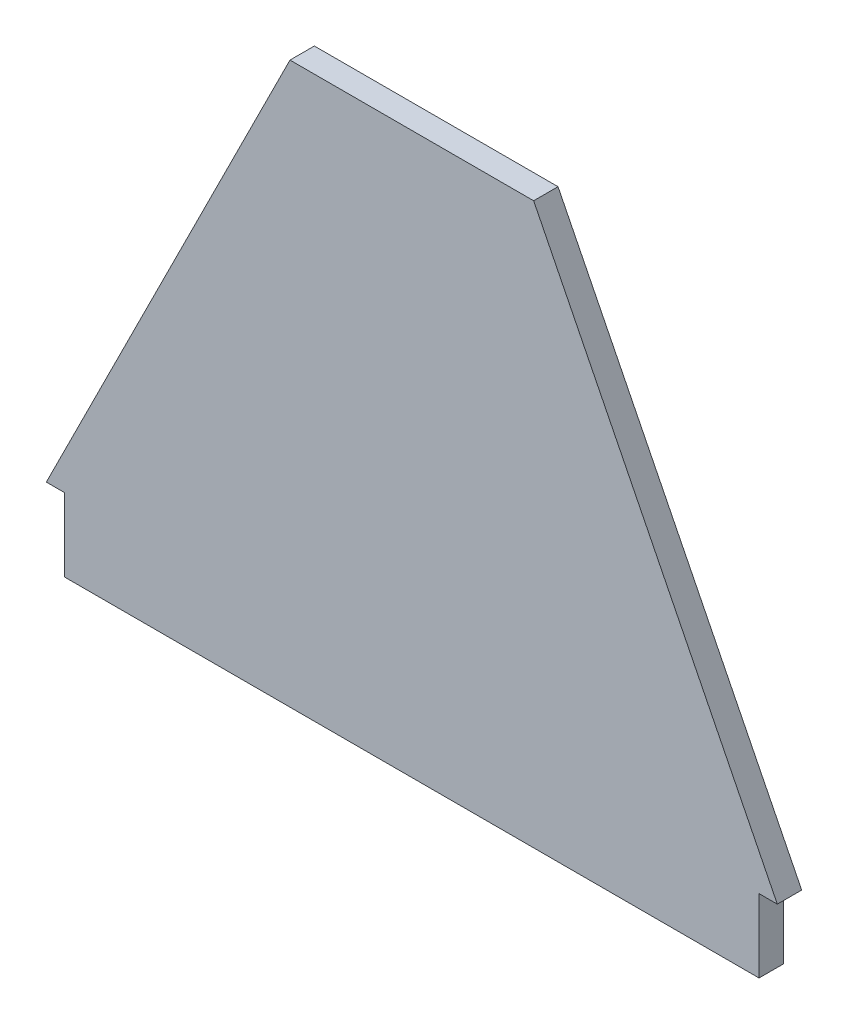
ISO-10303-21;
HEADER;
FILE_DESCRIPTION(('STEP AP214'),'2;1');
FILE_NAME('part.step','',(''),(''),'','','');
FILE_SCHEMA(('AUTOMOTIVE_DESIGN { 1 0 10303 214 1 1 1 1 }'));
ENDSEC;
DATA;
#1=APPLICATION_CONTEXT('core data for automotive mechanical design processes');
#2=APPLICATION_PROTOCOL_DEFINITION('international standard','automotive_design',2000,#1);
#3=PRODUCT_CONTEXT('',#1,'mechanical');
#4=PRODUCT('Part','Part','',(#3));
#5=PRODUCT_RELATED_PRODUCT_CATEGORY('part','',(#4));
#6=PRODUCT_DEFINITION_FORMATION('','',#4);
#7=PRODUCT_DEFINITION_CONTEXT('part definition',#1,'design');
#8=PRODUCT_DEFINITION('design','',#6,#7);
#9=PRODUCT_DEFINITION_SHAPE('','',#8);
#10=(LENGTH_UNIT() NAMED_UNIT(*) SI_UNIT(.MILLI.,.METRE.));
#11=(NAMED_UNIT(*) PLANE_ANGLE_UNIT() SI_UNIT($,.RADIAN.));
#12=(NAMED_UNIT(*) SI_UNIT($,.STERADIAN.) SOLID_ANGLE_UNIT());
#13=UNCERTAINTY_MEASURE_WITH_UNIT(LENGTH_MEASURE(1.E-05),#10,'distance_accuracy_value','');
#14=(GEOMETRIC_REPRESENTATION_CONTEXT(3) GLOBAL_UNCERTAINTY_ASSIGNED_CONTEXT((#13)) GLOBAL_UNIT_ASSIGNED_CONTEXT((#10,
#11,#12)) REPRESENTATION_CONTEXT('',''));
#15=CARTESIAN_POINT('',(0.,0.,0.));
#16=DIRECTION('',(0.,0.,1.));
#17=DIRECTION('',(1.,0.,0.));
#18=AXIS2_PLACEMENT_3D('',#15,#16,#17);
#19=CARTESIAN_POINT('',(-71.25,11.7259138972511,5.));
#20=DIRECTION('',(0.,1.,0.));
#21=DIRECTION('',(0.,0.,1.));
#22=AXIS2_PLACEMENT_3D('',#19,#20,#21);
#23=PLANE('',#22);
#24=DIRECTION('',(1.,0.,0.));
#25=VECTOR('',#24,1.);
#26=CARTESIAN_POINT('',(-71.25,11.7259138972511,0.));
#27=LINE('',#26,#25);
#28=CARTESIAN_POINT('',(-75.,11.7259138972511,0.));
#29=VERTEX_POINT('',#28);
#30=CARTESIAN_POINT('',(-71.25,11.7259138972511,0.));
#31=VERTEX_POINT('',#30);
#32=EDGE_CURVE('E135',#29,#31,#27,.T.);
#33=ORIENTED_EDGE('',*,*,#32,.T.);
#34=DIRECTION('',(0.,0.,-1.));
#35=VECTOR('',#34,1.);
#36=CARTESIAN_POINT('',(-71.25,11.7259138972511,5.));
#37=LINE('',#36,#35);
#38=CARTESIAN_POINT('',(-71.25,11.7259138972511,5.));
#39=VERTEX_POINT('',#38);
#40=EDGE_CURVE('E11',#39,#31,#37,.T.);
#41=ORIENTED_EDGE('',*,*,#40,.F.);
#42=DIRECTION('',(1.,0.,0.));
#43=VECTOR('',#42,1.);
#44=CARTESIAN_POINT('',(-71.25,11.7259138972511,5.));
#45=LINE('',#44,#43);
#46=CARTESIAN_POINT('',(-75.,11.7259138972511,5.));
#47=VERTEX_POINT('',#46);
#48=EDGE_CURVE('E149',#47,#39,#45,.T.);
#49=ORIENTED_EDGE('',*,*,#48,.F.);
#50=DIRECTION('',(0.,0.,-1.));
#51=VECTOR('',#50,1.);
#52=CARTESIAN_POINT('',(-75.,11.7259138972511,5.));
#53=LINE('',#52,#51);
#54=EDGE_CURVE('E131',#47,#29,#53,.T.);
#55=ORIENTED_EDGE('',*,*,#54,.T.);
#56=EDGE_LOOP('',(#33,#41,#49,#55));
#57=FACE_BOUND('',#56,.T.);
#58=ADVANCED_FACE('F39',(#57),#23,.F.);
#59=CARTESIAN_POINT('',(-71.25,-3.27408610274891,5.));
#60=DIRECTION('',(1.,0.,0.));
#61=DIRECTION('',(0.,0.,-1.));
#62=AXIS2_PLACEMENT_3D('',#59,#60,#61);
#63=PLANE('',#62);
#64=DIRECTION('',(0.,-1.,0.));
#65=VECTOR('',#64,1.);
#66=CARTESIAN_POINT('',(-71.25,-3.27408610274891,0.));
#67=LINE('',#66,#65);
#68=CARTESIAN_POINT('',(-71.25,-3.27408610274891,0.));
#69=VERTEX_POINT('',#68);
#70=EDGE_CURVE('E138',#31,#69,#67,.T.);
#71=ORIENTED_EDGE('',*,*,#70,.T.);
#72=DIRECTION('',(0.,0.,-1.));
#73=VECTOR('',#72,1.);
#74=CARTESIAN_POINT('',(-71.25,-3.27408610274891,5.));
#75=LINE('',#74,#73);
#76=CARTESIAN_POINT('',(-71.25,-3.27408610274891,5.));
#77=VERTEX_POINT('',#76);
#78=EDGE_CURVE('E47',#77,#69,#75,.T.);
#79=ORIENTED_EDGE('',*,*,#78,.F.);
#80=DIRECTION('',(0.,-1.,0.));
#81=VECTOR('',#80,1.);
#82=CARTESIAN_POINT('',(-71.25,-3.27408610274891,5.));
#83=LINE('',#82,#81);
#84=EDGE_CURVE('E98',#39,#77,#83,.T.);
#85=ORIENTED_EDGE('',*,*,#84,.F.);
#86=ORIENTED_EDGE('',*,*,#40,.T.);
#87=EDGE_LOOP('',(#71,#79,#85,#86));
#88=FACE_BOUND('',#87,.T.);
#89=ADVANCED_FACE('F184',(#88),#63,.F.);
#90=CARTESIAN_POINT('',(71.25,-3.27408610274891,5.));
#91=DIRECTION('',(0.,1.,0.));
#92=DIRECTION('',(0.,0.,1.));
#93=AXIS2_PLACEMENT_3D('',#90,#91,#92);
#94=PLANE('',#93);
#95=DIRECTION('',(1.,0.,0.));
#96=VECTOR('',#95,1.);
#97=CARTESIAN_POINT('',(71.25,-3.27408610274891,0.));
#98=LINE('',#97,#96);
#99=CARTESIAN_POINT('',(71.25,-3.27408610274891,0.));
#100=VERTEX_POINT('',#99);
#101=EDGE_CURVE('E140',#69,#100,#98,.T.);
#102=ORIENTED_EDGE('',*,*,#101,.T.);
#103=DIRECTION('',(0.,0.,-1.));
#104=VECTOR('',#103,1.);
#105=CARTESIAN_POINT('',(71.25,-3.27408610274891,5.));
#106=LINE('',#105,#104);
#107=CARTESIAN_POINT('',(71.25,-3.27408610274891,5.));
#108=VERTEX_POINT('',#107);
#109=EDGE_CURVE('E156',#108,#100,#106,.T.);
#110=ORIENTED_EDGE('',*,*,#109,.F.);
#111=DIRECTION('',(1.,0.,0.));
#112=VECTOR('',#111,1.);
#113=CARTESIAN_POINT('',(71.25,-3.27408610274891,5.));
#114=LINE('',#113,#112);
#115=EDGE_CURVE('E164',#77,#108,#114,.T.);
#116=ORIENTED_EDGE('',*,*,#115,.F.);
#117=ORIENTED_EDGE('',*,*,#78,.T.);
#118=EDGE_LOOP('',(#102,#110,#116,#117));
#119=FACE_BOUND('',#118,.T.);
#120=ADVANCED_FACE('F162',(#119),#94,.F.);
#121=CARTESIAN_POINT('',(71.25,11.7259138972511,5.));
#122=DIRECTION('',(-1.,0.,0.));
#123=DIRECTION('',(0.,0.,1.));
#124=AXIS2_PLACEMENT_3D('',#121,#122,#123);
#125=PLANE('',#124);
#126=DIRECTION('',(0.,1.,0.));
#127=VECTOR('',#126,1.);
#128=CARTESIAN_POINT('',(71.25,11.7259138972511,0.));
#129=LINE('',#128,#127);
#130=CARTESIAN_POINT('',(71.25,11.7259138972511,0.));
#131=VERTEX_POINT('',#130);
#132=EDGE_CURVE('E142',#100,#131,#129,.T.);
#133=ORIENTED_EDGE('',*,*,#132,.T.);
#134=DIRECTION('',(0.,0.,-1.));
#135=VECTOR('',#134,1.);
#136=CARTESIAN_POINT('',(71.25,11.7259138972511,5.));
#137=LINE('',#136,#135);
#138=CARTESIAN_POINT('',(71.25,11.7259138972511,5.));
#139=VERTEX_POINT('',#138);
#140=EDGE_CURVE('E153',#139,#131,#137,.T.);
#141=ORIENTED_EDGE('',*,*,#140,.F.);
#142=DIRECTION('',(0.,1.,0.));
#143=VECTOR('',#142,1.);
#144=CARTESIAN_POINT('',(71.25,11.7259138972511,5.));
#145=LINE('',#144,#143);
#146=EDGE_CURVE('E176',#108,#139,#145,.T.);
#147=ORIENTED_EDGE('',*,*,#146,.F.);
#148=ORIENTED_EDGE('',*,*,#109,.T.);
#149=EDGE_LOOP('',(#133,#141,#147,#148));
#150=FACE_BOUND('',#149,.T.);
#151=ADVANCED_FACE('F172',(#150),#125,.F.);
#152=CARTESIAN_POINT('',(75.,11.7259138972511,5.));
#153=DIRECTION('',(0.,1.,0.));
#154=DIRECTION('',(-1.,0.,0.));
#155=AXIS2_PLACEMENT_3D('',#152,#153,#154);
#156=PLANE('',#155);
#157=DIRECTION('',(1.,0.,0.));
#158=VECTOR('',#157,1.);
#159=CARTESIAN_POINT('',(75.,11.7259138972511,0.));
#160=LINE('',#159,#158);
#161=CARTESIAN_POINT('',(75.,11.7259138972511,0.));
#162=VERTEX_POINT('',#161);
#163=EDGE_CURVE('E144',#131,#162,#160,.T.);
#164=ORIENTED_EDGE('',*,*,#163,.T.);
#165=DIRECTION('',(0.,0.,-1.));
#166=VECTOR('',#165,1.);
#167=CARTESIAN_POINT('',(75.,11.7259138972511,5.));
#168=LINE('',#167,#166);
#169=CARTESIAN_POINT('',(75.,11.7259138972511,5.));
#170=VERTEX_POINT('',#169);
#171=EDGE_CURVE('E126',#170,#162,#168,.T.);
#172=ORIENTED_EDGE('',*,*,#171,.F.);
#173=DIRECTION('',(1.,0.,0.));
#174=VECTOR('',#173,1.);
#175=CARTESIAN_POINT('',(75.,11.7259138972511,5.));
#176=LINE('',#175,#174);
#177=EDGE_CURVE('E117',#139,#170,#176,.T.);
#178=ORIENTED_EDGE('',*,*,#177,.F.);
#179=ORIENTED_EDGE('',*,*,#140,.T.);
#180=EDGE_LOOP('',(#164,#172,#178,#179));
#181=FACE_BOUND('',#180,.T.);
#182=ADVANCED_FACE('F175',(#181),#156,.F.);
#183=CARTESIAN_POINT('',(75.,11.7259138972511,5.));
#184=DIRECTION('',(-0.894427190999916,-0.447213595499958,0.));
#185=DIRECTION('',(0.447213595499958,-0.894427190999916,0.));
#186=AXIS2_PLACEMENT_3D('',#183,#184,#185);
#187=PLANE('',#186);
#188=DIRECTION('',(-0.447213595499958,0.894427190999916,0.));
#189=VECTOR('',#188,1.);
#190=CARTESIAN_POINT('',(75.,11.7259138972511,0.));
#191=LINE('',#190,#189);
#192=CARTESIAN_POINT('',(25.,111.725913897251,0.));
#193=VERTEX_POINT('',#192);
#194=EDGE_CURVE('E125',#162,#193,#191,.T.);
#195=ORIENTED_EDGE('',*,*,#194,.T.);
#196=DIRECTION('',(0.,0.,-1.));
#197=VECTOR('',#196,1.);
#198=CARTESIAN_POINT('',(25.,111.725913897251,5.));
#199=LINE('',#198,#197);
#200=CARTESIAN_POINT('',(25.,111.725913897251,5.));
#201=VERTEX_POINT('',#200);
#202=EDGE_CURVE('E122',#201,#193,#199,.T.);
#203=ORIENTED_EDGE('',*,*,#202,.F.);
#204=DIRECTION('',(-0.447213595499958,0.894427190999916,0.));
#205=VECTOR('',#204,1.);
#206=CARTESIAN_POINT('',(75.,11.7259138972511,5.));
#207=LINE('',#206,#205);
#208=EDGE_CURVE('E111',#170,#201,#207,.T.);
#209=ORIENTED_EDGE('',*,*,#208,.F.);
#210=ORIENTED_EDGE('',*,*,#171,.T.);
#211=EDGE_LOOP('',(#195,#203,#209,#210));
#212=FACE_BOUND('',#211,.T.);
#213=ADVANCED_FACE('F123',(#212),#187,.F.);
#214=CARTESIAN_POINT('',(25.,111.725913897251,5.));
#215=DIRECTION('',(0.,-1.,0.));
#216=DIRECTION('',(1.,0.,0.));
#217=AXIS2_PLACEMENT_3D('',#214,#215,#216);
#218=PLANE('',#217);
#219=DIRECTION('',(-1.,0.,0.));
#220=VECTOR('',#219,1.);
#221=CARTESIAN_POINT('',(25.,111.725913897251,0.));
#222=LINE('',#221,#220);
#223=CARTESIAN_POINT('',(-25.,111.725913897251,0.));
#224=VERTEX_POINT('',#223);
#225=EDGE_CURVE('E84',#193,#224,#222,.T.);
#226=ORIENTED_EDGE('',*,*,#225,.T.);
#227=DIRECTION('',(0.,0.,-1.));
#228=VECTOR('',#227,1.);
#229=CARTESIAN_POINT('',(-25.,111.725913897251,5.));
#230=LINE('',#229,#228);
#231=CARTESIAN_POINT('',(-25.,111.725913897251,5.));
#232=VERTEX_POINT('',#231);
#233=EDGE_CURVE('E127',#232,#224,#230,.T.);
#234=ORIENTED_EDGE('',*,*,#233,.F.);
#235=DIRECTION('',(-1.,0.,0.));
#236=VECTOR('',#235,1.);
#237=CARTESIAN_POINT('',(25.,111.725913897251,5.));
#238=LINE('',#237,#236);
#239=EDGE_CURVE('E115',#201,#232,#238,.T.);
#240=ORIENTED_EDGE('',*,*,#239,.F.);
#241=ORIENTED_EDGE('',*,*,#202,.T.);
#242=EDGE_LOOP('',(#226,#234,#240,#241));
#243=FACE_BOUND('',#242,.T.);
#244=ADVANCED_FACE('F129',(#243),#218,.F.);
#245=CARTESIAN_POINT('',(-75.,11.7259138972511,5.));
#246=DIRECTION('',(0.894427190999916,-0.447213595499958,0.));
#247=DIRECTION('',(0.447213595499958,0.894427190999916,0.));
#248=AXIS2_PLACEMENT_3D('',#245,#246,#247);
#249=PLANE('',#248);
#250=DIRECTION('',(-0.447213595499958,-0.894427190999916,0.));
#251=VECTOR('',#250,1.);
#252=CARTESIAN_POINT('',(-75.,11.7259138972511,0.));
#253=LINE('',#252,#251);
#254=EDGE_CURVE('E90',#224,#29,#253,.T.);
#255=ORIENTED_EDGE('',*,*,#254,.T.);
#256=ORIENTED_EDGE('',*,*,#54,.F.);
#257=DIRECTION('',(-0.447213595499958,-0.894427190999916,0.));
#258=VECTOR('',#257,1.);
#259=CARTESIAN_POINT('',(-75.,11.7259138972511,5.));
#260=LINE('',#259,#258);
#261=EDGE_CURVE('E55',#232,#47,#260,.T.);
#262=ORIENTED_EDGE('',*,*,#261,.F.);
#263=ORIENTED_EDGE('',*,*,#233,.T.);
#264=EDGE_LOOP('',(#255,#256,#262,#263));
#265=FACE_BOUND('',#264,.T.);
#266=ADVANCED_FACE('F200',(#265),#249,.F.);
#267=CARTESIAN_POINT('',(0.,0.,5.));
#268=DIRECTION('',(0.,0.,1.));
#269=DIRECTION('',(1.,0.,0.));
#270=AXIS2_PLACEMENT_3D('',#267,#268,#269);
#271=PLANE('',#270);
#272=ORIENTED_EDGE('',*,*,#48,.T.);
#273=ORIENTED_EDGE('',*,*,#84,.T.);
#274=ORIENTED_EDGE('',*,*,#115,.T.);
#275=ORIENTED_EDGE('',*,*,#146,.T.);
#276=ORIENTED_EDGE('',*,*,#177,.T.);
#277=ORIENTED_EDGE('',*,*,#208,.T.);
#278=ORIENTED_EDGE('',*,*,#239,.T.);
#279=ORIENTED_EDGE('',*,*,#261,.T.);
#280=EDGE_LOOP('',(#272,#273,#274,#275,#276,#277,#278,#279));
#281=FACE_BOUND('',#280,.T.);
#282=ADVANCED_FACE('F113',(#281),#271,.T.);
#283=CARTESIAN_POINT('',(0.,0.,0.));
#284=DIRECTION('',(0.,0.,1.));
#285=DIRECTION('',(1.,0.,0.));
#286=AXIS2_PLACEMENT_3D('',#283,#284,#285);
#287=PLANE('',#286);
#288=ORIENTED_EDGE('',*,*,#32,.F.);
#289=ORIENTED_EDGE('',*,*,#254,.F.);
#290=ORIENTED_EDGE('',*,*,#225,.F.);
#291=ORIENTED_EDGE('',*,*,#194,.F.);
#292=ORIENTED_EDGE('',*,*,#163,.F.);
#293=ORIENTED_EDGE('',*,*,#132,.F.);
#294=ORIENTED_EDGE('',*,*,#101,.F.);
#295=ORIENTED_EDGE('',*,*,#70,.F.);
#296=EDGE_LOOP('',(#288,#289,#290,#291,#292,#293,#294,#295));
#297=FACE_BOUND('',#296,.T.);
#298=ADVANCED_FACE('F168',(#297),#287,.F.);
#299=CLOSED_SHELL('',(#58,#89,#120,#151,#182,#213,#244,#266,#282,#298));
#300=MANIFOLD_SOLID_BREP('B2',#299);
#301=ADVANCED_BREP_SHAPE_REPRESENTATION('',(#18,#300),#14);
#302=SHAPE_DEFINITION_REPRESENTATION(#9,#301);
ENDSEC;
END-ISO-10303-21;
